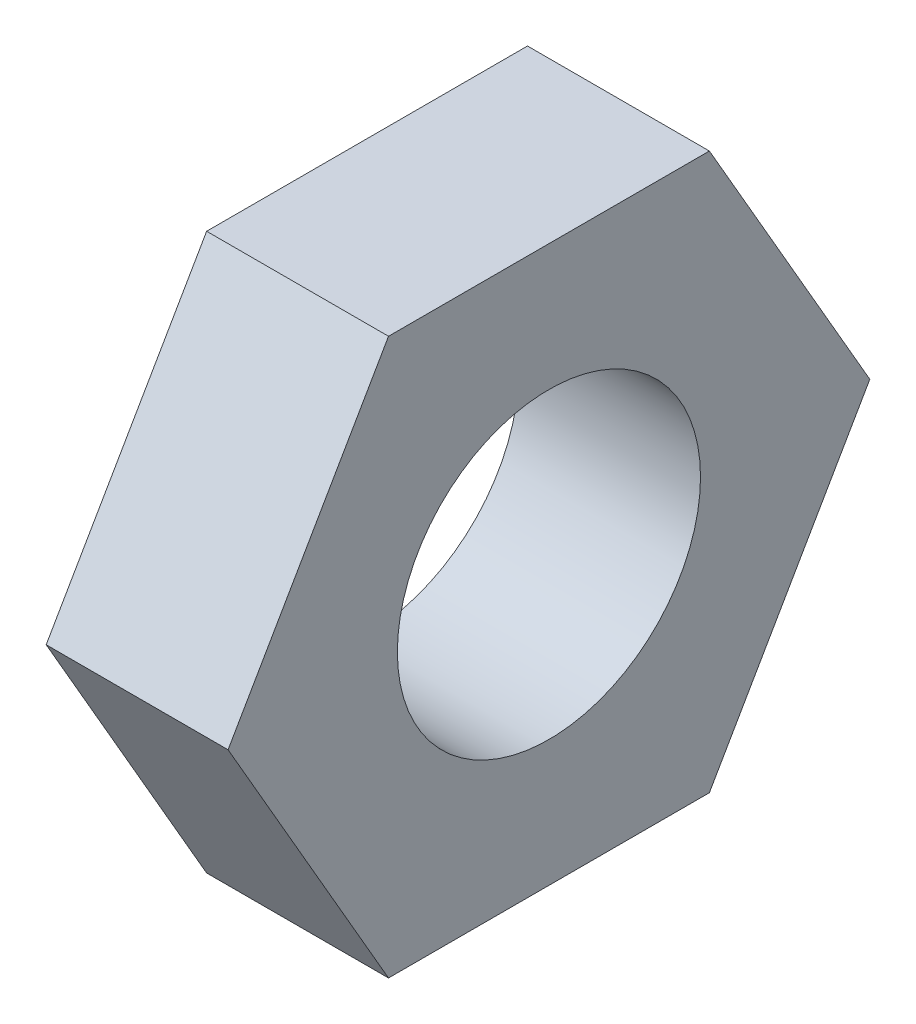
ISO-10303-21;
HEADER;
FILE_DESCRIPTION(('STEP AP214'),'2;1');
FILE_NAME('part.step','',(''),(''),'','','');
FILE_SCHEMA(('AUTOMOTIVE_DESIGN { 1 0 10303 214 1 1 1 1 }'));
ENDSEC;
DATA;
#1=APPLICATION_CONTEXT('core data for automotive mechanical design processes');
#2=APPLICATION_PROTOCOL_DEFINITION('international standard','automotive_design',2000,#1);
#3=PRODUCT_CONTEXT('',#1,'mechanical');
#4=PRODUCT('Part','Part','',(#3));
#5=PRODUCT_RELATED_PRODUCT_CATEGORY('part','',(#4));
#6=PRODUCT_DEFINITION_FORMATION('','',#4);
#7=PRODUCT_DEFINITION_CONTEXT('part definition',#1,'design');
#8=PRODUCT_DEFINITION('design','',#6,#7);
#9=PRODUCT_DEFINITION_SHAPE('','',#8);
#10=(LENGTH_UNIT() NAMED_UNIT(*) SI_UNIT(.MILLI.,.METRE.));
#11=(NAMED_UNIT(*) PLANE_ANGLE_UNIT() SI_UNIT($,.RADIAN.));
#12=(NAMED_UNIT(*) SI_UNIT($,.STERADIAN.) SOLID_ANGLE_UNIT());
#13=UNCERTAINTY_MEASURE_WITH_UNIT(LENGTH_MEASURE(1.E-05),#10,'distance_accuracy_value','');
#14=(GEOMETRIC_REPRESENTATION_CONTEXT(3) GLOBAL_UNCERTAINTY_ASSIGNED_CONTEXT((#13)) GLOBAL_UNIT_ASSIGNED_CONTEXT((#10,
#11,#12)) REPRESENTATION_CONTEXT('',''));
#15=CARTESIAN_POINT('',(0.,0.,0.));
#16=DIRECTION('',(0.,0.,1.));
#17=DIRECTION('',(1.,0.,0.));
#18=AXIS2_PLACEMENT_3D('',#15,#16,#17);
#19=CARTESIAN_POINT('',(1.8,-2.75,-1.58771324027147));
#20=DIRECTION('',(0.,0.5,0.866025403784439));
#21=DIRECTION('',(0.,-0.866025403784439,0.5));
#22=AXIS2_PLACEMENT_3D('',#19,#20,#21);
#23=PLANE('',#22);
#24=DIRECTION('',(0.,0.866025403784439,-0.5));
#25=VECTOR('',#24,1.);
#26=CARTESIAN_POINT('',(0.,-2.75,-1.58771324027147));
#27=LINE('',#26,#25);
#28=CARTESIAN_POINT('',(0.,-2.75,-1.58771324027147));
#29=VERTEX_POINT('',#28);
#30=CARTESIAN_POINT('',(0.,0.,-3.17542648054294));
#31=VERTEX_POINT('',#30);
#32=EDGE_CURVE('E129',#29,#31,#27,.T.);
#33=ORIENTED_EDGE('',*,*,#32,.T.);
#34=DIRECTION('',(-1.,0.,0.));
#35=VECTOR('',#34,1.);
#36=CARTESIAN_POINT('',(1.8,0.,-3.17542648054294));
#37=LINE('',#36,#35);
#38=CARTESIAN_POINT('',(1.8,0.,-3.17542648054294));
#39=VERTEX_POINT('',#38);
#40=EDGE_CURVE('E11',#39,#31,#37,.T.);
#41=ORIENTED_EDGE('',*,*,#40,.F.);
#42=DIRECTION('',(0.,0.866025403784439,-0.5));
#43=VECTOR('',#42,1.);
#44=CARTESIAN_POINT('',(1.8,-2.75,-1.58771324027147));
#45=LINE('',#44,#43);
#46=CARTESIAN_POINT('',(1.8,-2.75,-1.58771324027147));
#47=VERTEX_POINT('',#46);
#48=EDGE_CURVE('E139',#47,#39,#45,.T.);
#49=ORIENTED_EDGE('',*,*,#48,.F.);
#50=DIRECTION('',(-1.,0.,0.));
#51=VECTOR('',#50,1.);
#52=CARTESIAN_POINT('',(1.8,-2.75,-1.58771324027147));
#53=LINE('',#52,#51);
#54=EDGE_CURVE('E125',#47,#29,#53,.T.);
#55=ORIENTED_EDGE('',*,*,#54,.T.);
#56=EDGE_LOOP('',(#33,#41,#49,#55));
#57=FACE_BOUND('',#56,.T.);
#58=ADVANCED_FACE('F41',(#57),#23,.F.);
#59=CARTESIAN_POINT('',(1.8,0.,-3.17542648054294));
#60=DIRECTION('',(0.,-0.5,0.866025403784439));
#61=DIRECTION('',(0.,-0.866025403784439,-0.5));
#62=AXIS2_PLACEMENT_3D('',#59,#60,#61);
#63=PLANE('',#62);
#64=DIRECTION('',(0.,0.866025403784439,0.5));
#65=VECTOR('',#64,1.);
#66=CARTESIAN_POINT('',(0.,0.,-3.17542648054294));
#67=LINE('',#66,#65);
#68=CARTESIAN_POINT('',(0.,2.75,-1.58771324027147));
#69=VERTEX_POINT('',#68);
#70=EDGE_CURVE('E128',#31,#69,#67,.T.);
#71=ORIENTED_EDGE('',*,*,#70,.T.);
#72=DIRECTION('',(-1.,0.,0.));
#73=VECTOR('',#72,1.);
#74=CARTESIAN_POINT('',(1.8,2.75,-1.58771324027147));
#75=LINE('',#74,#73);
#76=CARTESIAN_POINT('',(1.8,2.75,-1.58771324027147));
#77=VERTEX_POINT('',#76);
#78=EDGE_CURVE('E49',#77,#69,#75,.T.);
#79=ORIENTED_EDGE('',*,*,#78,.F.);
#80=DIRECTION('',(0.,0.866025403784439,0.5));
#81=VECTOR('',#80,1.);
#82=CARTESIAN_POINT('',(1.8,0.,-3.17542648054294));
#83=LINE('',#82,#81);
#84=EDGE_CURVE('E91',#39,#77,#83,.T.);
#85=ORIENTED_EDGE('',*,*,#84,.F.);
#86=ORIENTED_EDGE('',*,*,#40,.T.);
#87=EDGE_LOOP('',(#71,#79,#85,#86));
#88=FACE_BOUND('',#87,.T.);
#89=ADVANCED_FACE('F161',(#88),#63,.F.);
#90=CARTESIAN_POINT('',(1.8,2.75,-1.58771324027147));
#91=DIRECTION('',(0.,-1.,0.));
#92=DIRECTION('',(0.,0.,-1.));
#93=AXIS2_PLACEMENT_3D('',#90,#91,#92);
#94=PLANE('',#93);
#95=DIRECTION('',(0.,0.,1.));
#96=VECTOR('',#95,1.);
#97=CARTESIAN_POINT('',(0.,2.75,-1.58771324027147));
#98=LINE('',#97,#96);
#99=CARTESIAN_POINT('',(0.,2.75,1.58771324027147));
#100=VERTEX_POINT('',#99);
#101=EDGE_CURVE('E132',#69,#100,#98,.T.);
#102=ORIENTED_EDGE('',*,*,#101,.T.);
#103=DIRECTION('',(-1.,0.,0.));
#104=VECTOR('',#103,1.);
#105=CARTESIAN_POINT('',(1.8,2.75,1.58771324027147));
#106=LINE('',#105,#104);
#107=CARTESIAN_POINT('',(1.8,2.75,1.58771324027147));
#108=VERTEX_POINT('',#107);
#109=EDGE_CURVE('E120',#108,#100,#106,.T.);
#110=ORIENTED_EDGE('',*,*,#109,.F.);
#111=DIRECTION('',(0.,0.,1.));
#112=VECTOR('',#111,1.);
#113=CARTESIAN_POINT('',(1.8,2.75,-1.58771324027147));
#114=LINE('',#113,#112);
#115=EDGE_CURVE('E108',#77,#108,#114,.T.);
#116=ORIENTED_EDGE('',*,*,#115,.F.);
#117=ORIENTED_EDGE('',*,*,#78,.T.);
#118=EDGE_LOOP('',(#102,#110,#116,#117));
#119=FACE_BOUND('',#118,.T.);
#120=ADVANCED_FACE('F144',(#119),#94,.F.);
#121=CARTESIAN_POINT('',(1.8,2.75,1.58771324027147));
#122=DIRECTION('',(0.,-0.5,-0.866025403784438));
#123=DIRECTION('',(0.,0.866025403784439,-0.5));
#124=AXIS2_PLACEMENT_3D('',#121,#122,#123);
#125=PLANE('',#124);
#126=DIRECTION('',(0.,-0.866025403784438,0.5));
#127=VECTOR('',#126,1.);
#128=CARTESIAN_POINT('',(0.,2.75,1.58771324027147));
#129=LINE('',#128,#127);
#130=CARTESIAN_POINT('',(0.,0.,3.17542648054294));
#131=VERTEX_POINT('',#130);
#132=EDGE_CURVE('E116',#100,#131,#129,.T.);
#133=ORIENTED_EDGE('',*,*,#132,.T.);
#134=DIRECTION('',(-1.,0.,0.));
#135=VECTOR('',#134,1.);
#136=CARTESIAN_POINT('',(1.8,0.,3.17542648054294));
#137=LINE('',#136,#135);
#138=CARTESIAN_POINT('',(1.8,0.,3.17542648054294));
#139=VERTEX_POINT('',#138);
#140=EDGE_CURVE('E113',#139,#131,#137,.T.);
#141=ORIENTED_EDGE('',*,*,#140,.F.);
#142=DIRECTION('',(0.,-0.866025403784438,0.5));
#143=VECTOR('',#142,1.);
#144=CARTESIAN_POINT('',(1.8,2.75,1.58771324027147));
#145=LINE('',#144,#143);
#146=EDGE_CURVE('E105',#108,#139,#145,.T.);
#147=ORIENTED_EDGE('',*,*,#146,.F.);
#148=ORIENTED_EDGE('',*,*,#109,.T.);
#149=EDGE_LOOP('',(#133,#141,#147,#148));
#150=FACE_BOUND('',#149,.T.);
#151=ADVANCED_FACE('F112',(#150),#125,.F.);
#152=CARTESIAN_POINT('',(1.8,0.,3.17542648054294));
#153=DIRECTION('',(0.,0.5,-0.866025403784439));
#154=DIRECTION('',(0.,0.866025403784439,0.5));
#155=AXIS2_PLACEMENT_3D('',#152,#153,#154);
#156=PLANE('',#155);
#157=DIRECTION('',(0.,-0.866025403784439,-0.5));
#158=VECTOR('',#157,1.);
#159=CARTESIAN_POINT('',(0.,0.,3.17542648054294));
#160=LINE('',#159,#158);
#161=CARTESIAN_POINT('',(0.,-2.75,1.58771324027147));
#162=VERTEX_POINT('',#161);
#163=EDGE_CURVE('E84',#131,#162,#160,.T.);
#164=ORIENTED_EDGE('',*,*,#163,.T.);
#165=DIRECTION('',(-1.,0.,0.));
#166=VECTOR('',#165,1.);
#167=CARTESIAN_POINT('',(1.8,-2.75,1.58771324027147));
#168=LINE('',#167,#166);
#169=CARTESIAN_POINT('',(1.8,-2.75,1.58771324027147));
#170=VERTEX_POINT('',#169);
#171=EDGE_CURVE('E117',#170,#162,#168,.T.);
#172=ORIENTED_EDGE('',*,*,#171,.F.);
#173=DIRECTION('',(0.,-0.866025403784439,-0.5));
#174=VECTOR('',#173,1.);
#175=CARTESIAN_POINT('',(1.8,0.,3.17542648054294));
#176=LINE('',#175,#174);
#177=EDGE_CURVE('E106',#139,#170,#176,.T.);
#178=ORIENTED_EDGE('',*,*,#177,.F.);
#179=ORIENTED_EDGE('',*,*,#140,.T.);
#180=EDGE_LOOP('',(#164,#172,#178,#179));
#181=FACE_BOUND('',#180,.T.);
#182=ADVANCED_FACE('F119',(#181),#156,.F.);
#183=CARTESIAN_POINT('',(1.8,-2.75,1.58771324027147));
#184=DIRECTION('',(0.,1.,0.));
#185=DIRECTION('',(0.,0.,1.));
#186=AXIS2_PLACEMENT_3D('',#183,#184,#185);
#187=PLANE('',#186);
#188=DIRECTION('',(0.,0.,-1.));
#189=VECTOR('',#188,1.);
#190=CARTESIAN_POINT('',(0.,-2.75,1.58771324027147));
#191=LINE('',#190,#189);
#192=EDGE_CURVE('E87',#162,#29,#191,.T.);
#193=ORIENTED_EDGE('',*,*,#192,.T.);
#194=ORIENTED_EDGE('',*,*,#54,.F.);
#195=DIRECTION('',(0.,0.,-1.));
#196=VECTOR('',#195,1.);
#197=CARTESIAN_POINT('',(1.8,-2.75,1.58771324027147));
#198=LINE('',#197,#196);
#199=EDGE_CURVE('E59',#170,#47,#198,.T.);
#200=ORIENTED_EDGE('',*,*,#199,.F.);
#201=ORIENTED_EDGE('',*,*,#171,.T.);
#202=EDGE_LOOP('',(#193,#194,#200,#201));
#203=FACE_BOUND('',#202,.T.);
#204=ADVANCED_FACE('F151',(#203),#187,.F.);
#205=CARTESIAN_POINT('',(1.8,0.,0.));
#206=DIRECTION('',(1.,0.,0.));
#207=DIRECTION('',(0.,0.,-1.));
#208=AXIS2_PLACEMENT_3D('',#205,#206,#207);
#209=PLANE('',#208);
#210=CARTESIAN_POINT('',(1.80000000000002,0.,0.));
#211=DIRECTION('',(1.,0.,0.));
#212=DIRECTION('',(0.,0.,-1.));
#213=AXIS2_PLACEMENT_3D('',#210,#211,#212);
#214=CIRCLE('',#213,1.5);
#215=CARTESIAN_POINT('',(1.80000000000002,0.,-1.5));
#216=VERTEX_POINT('',#215);
#217=EDGE_CURVE('E127',#216,#216,#214,.F.);
#218=ORIENTED_EDGE('',*,*,#217,.T.);
#219=EDGE_LOOP('',(#218));
#220=FACE_BOUND('',#219,.T.);
#221=ORIENTED_EDGE('',*,*,#48,.T.);
#222=ORIENTED_EDGE('',*,*,#84,.T.);
#223=ORIENTED_EDGE('',*,*,#115,.T.);
#224=ORIENTED_EDGE('',*,*,#146,.T.);
#225=ORIENTED_EDGE('',*,*,#177,.T.);
#226=ORIENTED_EDGE('',*,*,#199,.T.);
#227=EDGE_LOOP('',(#221,#222,#223,#224,#225,#226));
#228=FACE_BOUND('',#227,.T.);
#229=ADVANCED_FACE('F104',(#220,#228),#209,.T.);
#230=CARTESIAN_POINT('',(0.,0.,0.));
#231=DIRECTION('',(1.,0.,0.));
#232=DIRECTION('',(0.,0.,-1.));
#233=AXIS2_PLACEMENT_3D('',#230,#231,#232);
#234=PLANE('',#233);
#235=CARTESIAN_POINT('',(0.,0.,0.));
#236=DIRECTION('',(1.,0.,0.));
#237=DIRECTION('',(0.,0.,-1.));
#238=AXIS2_PLACEMENT_3D('',#235,#236,#237);
#239=CIRCLE('',#238,1.5);
#240=CARTESIAN_POINT('',(0.,0.,-1.5));
#241=VERTEX_POINT('',#240);
#242=EDGE_CURVE('E42',#241,#241,#239,.F.);
#243=ORIENTED_EDGE('',*,*,#242,.F.);
#244=EDGE_LOOP('',(#243));
#245=FACE_BOUND('',#244,.T.);
#246=ORIENTED_EDGE('',*,*,#32,.F.);
#247=ORIENTED_EDGE('',*,*,#192,.F.);
#248=ORIENTED_EDGE('',*,*,#163,.F.);
#249=ORIENTED_EDGE('',*,*,#132,.F.);
#250=ORIENTED_EDGE('',*,*,#101,.F.);
#251=ORIENTED_EDGE('',*,*,#70,.F.);
#252=EDGE_LOOP('',(#246,#247,#248,#249,#250,#251));
#253=FACE_BOUND('',#252,.T.);
#254=ADVANCED_FACE('F146',(#245,#253),#234,.F.);
#255=CARTESIAN_POINT('',(-1000.,0.,0.));
#256=DIRECTION('',(-1.,0.,0.));
#257=DIRECTION('',(0.,0.,1.));
#258=AXIS2_PLACEMENT_3D('',#255,#256,#257);
#259=CYLINDRICAL_SURFACE('',#258,1.5);
#260=ORIENTED_EDGE('',*,*,#217,.F.);
#261=EDGE_LOOP('',(#260));
#262=FACE_BOUND('',#261,.T.);
#263=ORIENTED_EDGE('',*,*,#242,.T.);
#264=EDGE_LOOP('',(#263));
#265=FACE_BOUND('',#264,.T.);
#266=ADVANCED_FACE('F204',(#262,#265),#259,.F.);
#267=CLOSED_SHELL('',(#58,#89,#120,#151,#182,#204,#229,#254,#266));
#268=MANIFOLD_SOLID_BREP('B2',#267);
#269=ADVANCED_BREP_SHAPE_REPRESENTATION('',(#18,#268),#14);
#270=SHAPE_DEFINITION_REPRESENTATION(#9,#269);
ENDSEC;
END-ISO-10303-21;
